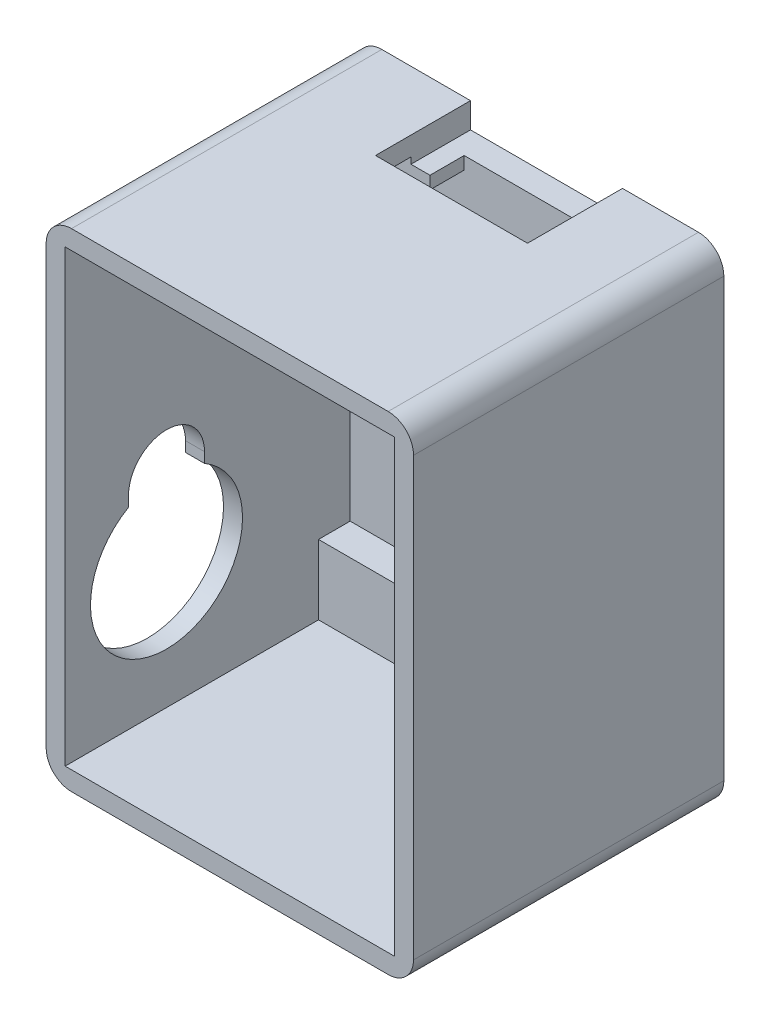
ISO-10303-21;
HEADER;
FILE_DESCRIPTION(('STEP AP214'),'2;1');
FILE_NAME('part.step','',(''),(''),'','','');
FILE_SCHEMA(('AUTOMOTIVE_DESIGN { 1 0 10303 214 1 1 1 1 }'));
ENDSEC;
DATA;
#1=APPLICATION_CONTEXT('core data for automotive mechanical design processes');
#2=APPLICATION_PROTOCOL_DEFINITION('international standard','automotive_design',2000,#1);
#3=PRODUCT_CONTEXT('',#1,'mechanical');
#4=PRODUCT('Part','Part','',(#3));
#5=PRODUCT_RELATED_PRODUCT_CATEGORY('part','',(#4));
#6=PRODUCT_DEFINITION_FORMATION('','',#4);
#7=PRODUCT_DEFINITION_CONTEXT('part definition',#1,'design');
#8=PRODUCT_DEFINITION('design','',#6,#7);
#9=PRODUCT_DEFINITION_SHAPE('','',#8);
#10=(LENGTH_UNIT() NAMED_UNIT(*) SI_UNIT(.MILLI.,.METRE.));
#11=(NAMED_UNIT(*) PLANE_ANGLE_UNIT() SI_UNIT($,.RADIAN.));
#12=(NAMED_UNIT(*) SI_UNIT($,.STERADIAN.) SOLID_ANGLE_UNIT());
#13=UNCERTAINTY_MEASURE_WITH_UNIT(LENGTH_MEASURE(1.E-05),#10,'distance_accuracy_value','');
#14=(GEOMETRIC_REPRESENTATION_CONTEXT(3) GLOBAL_UNCERTAINTY_ASSIGNED_CONTEXT((#13)) GLOBAL_UNIT_ASSIGNED_CONTEXT((#10,
#11,#12)) REPRESENTATION_CONTEXT('',''));
#15=CARTESIAN_POINT('',(0.,0.,0.));
#16=DIRECTION('',(0.,0.,1.));
#17=DIRECTION('',(1.,0.,0.));
#18=AXIS2_PLACEMENT_3D('',#15,#16,#17);
#19=CARTESIAN_POINT('',(0.,0.,1.5));
#20=DIRECTION('',(0.,0.,1.));
#21=DIRECTION('',(1.,0.,0.));
#22=AXIS2_PLACEMENT_3D('',#19,#20,#21);
#23=PLANE('',#22);
#24=DIRECTION('',(0.,-1.,0.));
#25=VECTOR('',#24,1.);
#26=CARTESIAN_POINT('',(19.5,-1.5,1.5));
#27=LINE('',#26,#25);
#28=CARTESIAN_POINT('',(19.5,-2.,1.5));
#29=VERTEX_POINT('',#28);
#30=CARTESIAN_POINT('',(19.5,-3.,1.5));
#31=VERTEX_POINT('',#30);
#32=EDGE_CURVE('E350',#29,#31,#27,.T.);
#33=ORIENTED_EDGE('',*,*,#32,.F.);
#34=DIRECTION('',(-1.,0.,0.));
#35=VECTOR('',#34,1.);
#36=CARTESIAN_POINT('',(0.,-2.,1.5));
#37=LINE('',#36,#35);
#38=CARTESIAN_POINT('',(10.5,-2.,1.5));
#39=VERTEX_POINT('',#38);
#40=EDGE_CURVE('E270',#29,#39,#37,.T.);
#41=ORIENTED_EDGE('',*,*,#40,.T.);
#42=DIRECTION('',(0.,1.,0.));
#43=VECTOR('',#42,1.);
#44=CARTESIAN_POINT('',(10.5,-1.5,1.5));
#45=LINE('',#44,#43);
#46=CARTESIAN_POINT('',(10.5,-3.,1.5));
#47=VERTEX_POINT('',#46);
#48=EDGE_CURVE('E333',#47,#39,#45,.T.);
#49=ORIENTED_EDGE('',*,*,#48,.F.);
#50=DIRECTION('',(-1.,0.,0.));
#51=VECTOR('',#50,1.);
#52=CARTESIAN_POINT('',(10.5,-3.,1.5));
#53=LINE('',#52,#51);
#54=CARTESIAN_POINT('',(1.5,-3.,1.5));
#55=VERTEX_POINT('',#54);
#56=EDGE_CURVE('E340',#47,#55,#53,.T.);
#57=ORIENTED_EDGE('',*,*,#56,.T.);
#58=DIRECTION('',(0.,-1.,0.));
#59=VECTOR('',#58,1.);
#60=CARTESIAN_POINT('',(1.5,0.,1.5));
#61=LINE('',#60,#59);
#62=CARTESIAN_POINT('',(1.5,-31.5,1.5));
#63=VERTEX_POINT('',#62);
#64=EDGE_CURVE('E382',#55,#63,#61,.T.);
#65=ORIENTED_EDGE('',*,*,#64,.T.);
#66=DIRECTION('',(-1.,0.,0.));
#67=VECTOR('',#66,1.);
#68=CARTESIAN_POINT('',(27.5,-31.5,1.5));
#69=LINE('',#68,#67);
#70=CARTESIAN_POINT('',(27.5,-31.5,1.5));
#71=VERTEX_POINT('',#70);
#72=EDGE_CURVE('E365',#71,#63,#69,.T.);
#73=ORIENTED_EDGE('',*,*,#72,.F.);
#74=DIRECTION('',(0.,1.,0.));
#75=VECTOR('',#74,1.);
#76=CARTESIAN_POINT('',(27.5,0.,1.5));
#77=LINE('',#76,#75);
#78=CARTESIAN_POINT('',(27.5,-3.,1.5));
#79=VERTEX_POINT('',#78);
#80=EDGE_CURVE('E384',#71,#79,#77,.T.);
#81=ORIENTED_EDGE('',*,*,#80,.T.);
#82=DIRECTION('',(1.,0.,0.));
#83=VECTOR('',#82,1.);
#84=CARTESIAN_POINT('',(19.5,-3.,1.5));
#85=LINE('',#84,#83);
#86=EDGE_CURVE('E361',#31,#79,#85,.T.);
#87=ORIENTED_EDGE('',*,*,#86,.F.);
#88=EDGE_LOOP('',(#33,#41,#49,#57,#65,#73,#81,#87));
#89=FACE_BOUND('',#88,.T.);
#90=ADVANCED_FACE('F35',(#89),#23,.T.);
#91=CARTESIAN_POINT('',(0.,-1.5,24.));
#92=DIRECTION('',(0.,-1.,0.));
#93=DIRECTION('',(0.,0.,-1.));
#94=AXIS2_PLACEMENT_3D('',#91,#92,#93);
#95=PLANE('',#94);
#96=DIRECTION('',(1.,0.,0.));
#97=VECTOR('',#96,1.);
#98=CARTESIAN_POINT('',(0.,-1.5,7.));
#99=LINE('',#98,#97);
#100=CARTESIAN_POINT('',(9.,-1.5,7.));
#101=VERTEX_POINT('',#100);
#102=CARTESIAN_POINT('',(21.,-1.5,7.));
#103=VERTEX_POINT('',#102);
#104=EDGE_CURVE('E239',#101,#103,#99,.T.);
#105=ORIENTED_EDGE('',*,*,#104,.T.);
#106=DIRECTION('',(0.,0.,-1.));
#107=VECTOR('',#106,1.);
#108=CARTESIAN_POINT('',(21.,-1.5,24.));
#109=LINE('',#108,#107);
#110=CARTESIAN_POINT('',(21.,-1.5,4.2));
#111=VERTEX_POINT('',#110);
#112=EDGE_CURVE('E279',#103,#111,#109,.T.);
#113=ORIENTED_EDGE('',*,*,#112,.T.);
#114=DIRECTION('',(1.,0.,0.));
#115=VECTOR('',#114,1.);
#116=CARTESIAN_POINT('',(19.5,-1.5,4.2));
#117=LINE('',#116,#115);
#118=CARTESIAN_POINT('',(27.5,-1.5,4.2));
#119=VERTEX_POINT('',#118);
#120=EDGE_CURVE('E363',#111,#119,#117,.T.);
#121=ORIENTED_EDGE('',*,*,#120,.T.);
#122=DIRECTION('',(0.,0.,-1.));
#123=VECTOR('',#122,1.);
#124=CARTESIAN_POINT('',(27.5,-1.5,24.));
#125=LINE('',#124,#123);
#126=CARTESIAN_POINT('',(27.5,-1.5,24.));
#127=VERTEX_POINT('',#126);
#128=EDGE_CURVE('E393',#127,#119,#125,.T.);
#129=ORIENTED_EDGE('',*,*,#128,.F.);
#130=DIRECTION('',(-1.,0.,0.));
#131=VECTOR('',#130,1.);
#132=CARTESIAN_POINT('',(0.,-1.5,24.));
#133=LINE('',#132,#131);
#134=CARTESIAN_POINT('',(1.5,-1.5,24.));
#135=VERTEX_POINT('',#134);
#136=EDGE_CURVE('E394',#127,#135,#133,.T.);
#137=ORIENTED_EDGE('',*,*,#136,.T.);
#138=DIRECTION('',(0.,0.,-1.));
#139=VECTOR('',#138,1.);
#140=CARTESIAN_POINT('',(1.5,-1.5,24.));
#141=LINE('',#140,#139);
#142=CARTESIAN_POINT('',(1.5,-1.5,4.2));
#143=VERTEX_POINT('',#142);
#144=EDGE_CURVE('E390',#135,#143,#141,.T.);
#145=ORIENTED_EDGE('',*,*,#144,.T.);
#146=DIRECTION('',(-1.,0.,0.));
#147=VECTOR('',#146,1.);
#148=CARTESIAN_POINT('',(10.5,-1.5,4.2));
#149=LINE('',#148,#147);
#150=CARTESIAN_POINT('',(9.,-1.5,4.2));
#151=VERTEX_POINT('',#150);
#152=EDGE_CURVE('E336',#151,#143,#149,.T.);
#153=ORIENTED_EDGE('',*,*,#152,.F.);
#154=DIRECTION('',(0.,0.,1.));
#155=VECTOR('',#154,1.);
#156=CARTESIAN_POINT('',(9.,-1.5,24.));
#157=LINE('',#156,#155);
#158=EDGE_CURVE('E265',#151,#101,#157,.T.);
#159=ORIENTED_EDGE('',*,*,#158,.T.);
#160=EDGE_LOOP('',(#105,#113,#121,#129,#137,#145,#153,#159));
#161=FACE_BOUND('',#160,.T.);
#162=ADVANCED_FACE('F501',(#161),#95,.T.);
#163=CARTESIAN_POINT('',(0.,0.,24.));
#164=DIRECTION('',(0.,-1.,0.));
#165=DIRECTION('',(0.,0.,-1.));
#166=AXIS2_PLACEMENT_3D('',#163,#164,#165);
#167=PLANE('',#166);
#168=DIRECTION('',(0.,0.,1.));
#169=VECTOR('',#168,1.);
#170=CARTESIAN_POINT('',(21.,0.,-1.5));
#171=LINE('',#170,#169);
#172=CARTESIAN_POINT('',(21.,0.,-0.5));
#173=VERTEX_POINT('',#172);
#174=CARTESIAN_POINT('',(21.,0.,7.));
#175=VERTEX_POINT('',#174);
#176=EDGE_CURVE('E251',#173,#175,#171,.T.);
#177=ORIENTED_EDGE('',*,*,#176,.T.);
#178=DIRECTION('',(1.,0.,0.));
#179=VECTOR('',#178,1.);
#180=CARTESIAN_POINT('',(21.,0.,7.));
#181=LINE('',#180,#179);
#182=CARTESIAN_POINT('',(9.,0.,7.));
#183=VERTEX_POINT('',#182);
#184=EDGE_CURVE('E236',#183,#175,#181,.T.);
#185=ORIENTED_EDGE('',*,*,#184,.F.);
#186=DIRECTION('',(0.,0.,1.));
#187=VECTOR('',#186,1.);
#188=CARTESIAN_POINT('',(9.,0.,-1.5));
#189=LINE('',#188,#187);
#190=CARTESIAN_POINT('',(9.,0.,-0.5));
#191=VERTEX_POINT('',#190);
#192=EDGE_CURVE('E244',#191,#183,#189,.T.);
#193=ORIENTED_EDGE('',*,*,#192,.F.);
#194=DIRECTION('',(1.,0.,0.));
#195=VECTOR('',#194,1.);
#196=CARTESIAN_POINT('',(0.,0.,-0.5));
#197=LINE('',#196,#195);
#198=CARTESIAN_POINT('',(2.,0.,-0.5));
#199=VERTEX_POINT('',#198);
#200=EDGE_CURVE('E287',#199,#191,#197,.T.);
#201=ORIENTED_EDGE('',*,*,#200,.F.);
#202=DIRECTION('',(0.,0.,-1.));
#203=VECTOR('',#202,1.);
#204=CARTESIAN_POINT('',(2.,0.,24.));
#205=LINE('',#204,#203);
#206=CARTESIAN_POINT('',(2.,0.,24.));
#207=VERTEX_POINT('',#206);
#208=EDGE_CURVE('E420',#199,#207,#205,.F.);
#209=ORIENTED_EDGE('',*,*,#208,.T.);
#210=DIRECTION('',(-1.,0.,0.));
#211=VECTOR('',#210,1.);
#212=CARTESIAN_POINT('',(0.,0.,24.));
#213=LINE('',#212,#211);
#214=CARTESIAN_POINT('',(27.,0.,24.));
#215=VERTEX_POINT('',#214);
#216=EDGE_CURVE('E417',#215,#207,#213,.T.);
#217=ORIENTED_EDGE('',*,*,#216,.F.);
#218=DIRECTION('',(0.,0.,-1.));
#219=VECTOR('',#218,1.);
#220=CARTESIAN_POINT('',(27.,0.,24.));
#221=LINE('',#220,#219);
#222=CARTESIAN_POINT('',(27.,0.,-0.5));
#223=VERTEX_POINT('',#222);
#224=EDGE_CURVE('E422',#215,#223,#221,.T.);
#225=ORIENTED_EDGE('',*,*,#224,.T.);
#226=EDGE_CURVE('E286',#173,#223,#197,.T.);
#227=ORIENTED_EDGE('',*,*,#226,.F.);
#228=EDGE_LOOP('',(#177,#185,#193,#201,#209,#217,#225,#227));
#229=FACE_BOUND('',#228,.T.);
#230=ADVANCED_FACE('F253',(#229),#167,.F.);
#231=CARTESIAN_POINT('',(19.5,-1.5,4.2));
#232=DIRECTION('',(0.,0.,-1.));
#233=DIRECTION('',(-1.,0.,0.));
#234=AXIS2_PLACEMENT_3D('',#231,#232,#233);
#235=PLANE('',#234);
#236=DIRECTION('',(0.,1.,0.));
#237=VECTOR('',#236,1.);
#238=CARTESIAN_POINT('',(21.,-1.5,4.2));
#239=LINE('',#238,#237);
#240=CARTESIAN_POINT('',(21.,-2.,4.2));
#241=VERTEX_POINT('',#240);
#242=EDGE_CURVE('E277',#241,#111,#239,.T.);
#243=ORIENTED_EDGE('',*,*,#242,.F.);
#244=DIRECTION('',(1.,0.,0.));
#245=VECTOR('',#244,1.);
#246=CARTESIAN_POINT('',(19.5,-2.,4.2));
#247=LINE('',#246,#245);
#248=CARTESIAN_POINT('',(19.5,-2.,4.2));
#249=VERTEX_POINT('',#248);
#250=EDGE_CURVE('E275',#249,#241,#247,.T.);
#251=ORIENTED_EDGE('',*,*,#250,.F.);
#252=DIRECTION('',(0.,1.,0.));
#253=VECTOR('',#252,1.);
#254=CARTESIAN_POINT('',(19.5,-1.5,4.2));
#255=LINE('',#254,#253);
#256=CARTESIAN_POINT('',(19.5,-3.,4.2));
#257=VERTEX_POINT('',#256);
#258=EDGE_CURVE('E347',#257,#249,#255,.T.);
#259=ORIENTED_EDGE('',*,*,#258,.F.);
#260=DIRECTION('',(1.,0.,0.));
#261=VECTOR('',#260,1.);
#262=CARTESIAN_POINT('',(19.5,-3.,4.2));
#263=LINE('',#262,#261);
#264=CARTESIAN_POINT('',(27.5,-3.,4.2));
#265=VERTEX_POINT('',#264);
#266=EDGE_CURVE('E355',#257,#265,#263,.T.);
#267=ORIENTED_EDGE('',*,*,#266,.T.);
#268=DIRECTION('',(0.,1.,0.));
#269=VECTOR('',#268,1.);
#270=CARTESIAN_POINT('',(27.5,-1.5,4.2));
#271=LINE('',#270,#269);
#272=EDGE_CURVE('E346',#265,#119,#271,.T.);
#273=ORIENTED_EDGE('',*,*,#272,.T.);
#274=ORIENTED_EDGE('',*,*,#120,.F.);
#275=EDGE_LOOP('',(#243,#251,#259,#267,#273,#274));
#276=FACE_BOUND('',#275,.T.);
#277=ADVANCED_FACE('F530',(#276),#235,.F.);
#278=CARTESIAN_POINT('',(19.5,0.,0.));
#279=DIRECTION('',(1.,0.,0.));
#280=DIRECTION('',(0.,0.,-1.));
#281=AXIS2_PLACEMENT_3D('',#278,#279,#280);
#282=PLANE('',#281);
#283=DIRECTION('',(0.,0.,1.));
#284=VECTOR('',#283,1.);
#285=CARTESIAN_POINT('',(19.5,-2.,0.));
#286=LINE('',#285,#284);
#287=EDGE_CURVE('E273',#29,#249,#286,.T.);
#288=ORIENTED_EDGE('',*,*,#287,.F.);
#289=ORIENTED_EDGE('',*,*,#32,.T.);
#290=DIRECTION('',(0.,0.,1.));
#291=VECTOR('',#290,1.);
#292=CARTESIAN_POINT('',(19.5,-3.,4.2));
#293=LINE('',#292,#291);
#294=EDGE_CURVE('E353',#31,#257,#293,.T.);
#295=ORIENTED_EDGE('',*,*,#294,.T.);
#296=ORIENTED_EDGE('',*,*,#258,.T.);
#297=EDGE_LOOP('',(#288,#289,#295,#296));
#298=FACE_BOUND('',#297,.T.);
#299=ADVANCED_FACE('F525',(#298),#282,.F.);
#300=CARTESIAN_POINT('',(10.5,-1.5,4.2));
#301=DIRECTION('',(0.,0.,-1.));
#302=DIRECTION('',(-1.,0.,0.));
#303=AXIS2_PLACEMENT_3D('',#300,#301,#302);
#304=PLANE('',#303);
#305=DIRECTION('',(1.,0.,0.));
#306=VECTOR('',#305,1.);
#307=CARTESIAN_POINT('',(10.5,-2.,4.2));
#308=LINE('',#307,#306);
#309=CARTESIAN_POINT('',(9.,-2.,4.2));
#310=VERTEX_POINT('',#309);
#311=CARTESIAN_POINT('',(10.5,-2.,4.2));
#312=VERTEX_POINT('',#311);
#313=EDGE_CURVE('E50',#310,#312,#308,.T.);
#314=ORIENTED_EDGE('',*,*,#313,.F.);
#315=DIRECTION('',(0.,-1.,0.));
#316=VECTOR('',#315,1.);
#317=CARTESIAN_POINT('',(9.,-1.5,4.2));
#318=LINE('',#317,#316);
#319=EDGE_CURVE('E263',#151,#310,#318,.T.);
#320=ORIENTED_EDGE('',*,*,#319,.F.);
#321=ORIENTED_EDGE('',*,*,#152,.T.);
#322=DIRECTION('',(0.,-1.,0.));
#323=VECTOR('',#322,1.);
#324=CARTESIAN_POINT('',(1.5,-1.5,4.2));
#325=LINE('',#324,#323);
#326=CARTESIAN_POINT('',(1.5,-3.,4.2));
#327=VERTEX_POINT('',#326);
#328=EDGE_CURVE('E321',#143,#327,#325,.T.);
#329=ORIENTED_EDGE('',*,*,#328,.T.);
#330=DIRECTION('',(-1.,0.,0.));
#331=VECTOR('',#330,1.);
#332=CARTESIAN_POINT('',(10.5,-3.,4.2));
#333=LINE('',#332,#331);
#334=CARTESIAN_POINT('',(10.5,-3.,4.2));
#335=VERTEX_POINT('',#334);
#336=EDGE_CURVE('E343',#335,#327,#333,.T.);
#337=ORIENTED_EDGE('',*,*,#336,.F.);
#338=DIRECTION('',(0.,-1.,0.));
#339=VECTOR('',#338,1.);
#340=CARTESIAN_POINT('',(10.5,-1.5,4.2));
#341=LINE('',#340,#339);
#342=EDGE_CURVE('E328',#312,#335,#341,.T.);
#343=ORIENTED_EDGE('',*,*,#342,.F.);
#344=EDGE_LOOP('',(#314,#320,#321,#329,#337,#343));
#345=FACE_BOUND('',#344,.T.);
#346=ADVANCED_FACE('F506',(#345),#304,.F.);
#347=CARTESIAN_POINT('',(10.5,0.,0.));
#348=DIRECTION('',(1.,0.,0.));
#349=DIRECTION('',(0.,1.,0.));
#350=AXIS2_PLACEMENT_3D('',#347,#348,#349);
#351=PLANE('',#350);
#352=ORIENTED_EDGE('',*,*,#48,.T.);
#353=DIRECTION('',(0.,0.,1.));
#354=VECTOR('',#353,1.);
#355=CARTESIAN_POINT('',(10.5,-2.,0.));
#356=LINE('',#355,#354);
#357=EDGE_CURVE('E267',#39,#312,#356,.T.);
#358=ORIENTED_EDGE('',*,*,#357,.T.);
#359=ORIENTED_EDGE('',*,*,#342,.T.);
#360=DIRECTION('',(0.,0.,-1.));
#361=VECTOR('',#360,1.);
#362=CARTESIAN_POINT('',(10.5,-3.,4.2));
#363=LINE('',#362,#361);
#364=EDGE_CURVE('E330',#335,#47,#363,.T.);
#365=ORIENTED_EDGE('',*,*,#364,.T.);
#366=EDGE_LOOP('',(#352,#358,#359,#365));
#367=FACE_BOUND('',#366,.T.);
#368=ADVANCED_FACE('F512',(#367),#351,.T.);
#369=CARTESIAN_POINT('',(0.,0.,-0.5));
#370=DIRECTION('',(0.,0.,1.));
#371=DIRECTION('',(1.,0.,0.));
#372=AXIS2_PLACEMENT_3D('',#369,#370,#371);
#373=PLANE('',#372);
#374=DIRECTION('',(0.,-1.,0.));
#375=VECTOR('',#374,1.);
#376=CARTESIAN_POINT('',(21.,0.,-0.5));
#377=LINE('',#376,#375);
#378=CARTESIAN_POINT('',(21.,-2.,-0.5));
#379=VERTEX_POINT('',#378);
#380=EDGE_CURVE('E11',#173,#379,#377,.T.);
#381=ORIENTED_EDGE('',*,*,#380,.F.);
#382=ORIENTED_EDGE('',*,*,#226,.T.);
#383=CARTESIAN_POINT('',(27.,-2.,-0.5));
#384=DIRECTION('',(0.,0.,1.));
#385=DIRECTION('',(1.,0.,0.));
#386=AXIS2_PLACEMENT_3D('',#383,#384,#385);
#387=CIRCLE('',#386,2.);
#388=CARTESIAN_POINT('',(29.,-2.,-0.5));
#389=VERTEX_POINT('',#388);
#390=EDGE_CURVE('E431',#223,#389,#387,.F.);
#391=ORIENTED_EDGE('',*,*,#390,.T.);
#392=DIRECTION('',(0.,-1.,0.));
#393=VECTOR('',#392,1.);
#394=CARTESIAN_POINT('',(29.,0.,-0.5));
#395=LINE('',#394,#393);
#396=CARTESIAN_POINT('',(29.,-36.5,-0.5));
#397=VERTEX_POINT('',#396);
#398=EDGE_CURVE('E289',#389,#397,#395,.T.);
#399=ORIENTED_EDGE('',*,*,#398,.T.);
#400=CARTESIAN_POINT('',(27.,-36.5,-0.5));
#401=DIRECTION('',(0.,0.,1.));
#402=DIRECTION('',(1.,0.,0.));
#403=AXIS2_PLACEMENT_3D('',#400,#401,#402);
#404=CIRCLE('',#403,2.);
#405=CARTESIAN_POINT('',(27.,-38.5,-0.5));
#406=VERTEX_POINT('',#405);
#407=EDGE_CURVE('E429',#397,#406,#404,.F.);
#408=ORIENTED_EDGE('',*,*,#407,.T.);
#409=DIRECTION('',(-1.,0.,0.));
#410=VECTOR('',#409,1.);
#411=CARTESIAN_POINT('',(0.,-38.5,-0.5));
#412=LINE('',#411,#410);
#413=CARTESIAN_POINT('',(2.,-38.5,-0.5));
#414=VERTEX_POINT('',#413);
#415=EDGE_CURVE('E292',#406,#414,#412,.T.);
#416=ORIENTED_EDGE('',*,*,#415,.T.);
#417=CARTESIAN_POINT('',(2.,-36.5,-0.5));
#418=DIRECTION('',(0.,0.,1.));
#419=DIRECTION('',(1.,0.,0.));
#420=AXIS2_PLACEMENT_3D('',#417,#418,#419);
#421=CIRCLE('',#420,2.);
#422=CARTESIAN_POINT('',(0.,-36.5,-0.5));
#423=VERTEX_POINT('',#422);
#424=EDGE_CURVE('E427',#414,#423,#421,.F.);
#425=ORIENTED_EDGE('',*,*,#424,.T.);
#426=DIRECTION('',(0.,1.,0.));
#427=VECTOR('',#426,1.);
#428=CARTESIAN_POINT('',(0.,0.,-0.5));
#429=LINE('',#428,#427);
#430=CARTESIAN_POINT('',(0.,-2.,-0.5));
#431=VERTEX_POINT('',#430);
#432=EDGE_CURVE('E283',#423,#431,#429,.T.);
#433=ORIENTED_EDGE('',*,*,#432,.T.);
#434=CARTESIAN_POINT('',(2.,-2.,-0.5));
#435=DIRECTION('',(0.,0.,1.));
#436=DIRECTION('',(1.,0.,0.));
#437=AXIS2_PLACEMENT_3D('',#434,#435,#436);
#438=CIRCLE('',#437,2.);
#439=EDGE_CURVE('E425',#431,#199,#438,.F.);
#440=ORIENTED_EDGE('',*,*,#439,.T.);
#441=ORIENTED_EDGE('',*,*,#200,.T.);
#442=DIRECTION('',(0.,1.,0.));
#443=VECTOR('',#442,1.);
#444=CARTESIAN_POINT('',(9.,0.,-0.5));
#445=LINE('',#444,#443);
#446=CARTESIAN_POINT('',(9.,-2.,-0.5));
#447=VERTEX_POINT('',#446);
#448=EDGE_CURVE('E247',#447,#191,#445,.T.);
#449=ORIENTED_EDGE('',*,*,#448,.F.);
#450=DIRECTION('',(-1.,0.,0.));
#451=VECTOR('',#450,1.);
#452=CARTESIAN_POINT('',(0.,-2.,-0.5));
#453=LINE('',#452,#451);
#454=EDGE_CURVE('E43',#379,#447,#453,.T.);
#455=ORIENTED_EDGE('',*,*,#454,.F.);
#456=EDGE_LOOP('',(#381,#382,#391,#399,#408,#416,#425,#433,#440,#441,#449,#455));
#457=FACE_BOUND('',#456,.T.);
#458=ADVANCED_FACE('F461',(#457),#373,.F.);
#459=CARTESIAN_POINT('',(1.5,0.,24.));
#460=DIRECTION('',(1.,0.,0.));
#461=DIRECTION('',(0.,1.,0.));
#462=AXIS2_PLACEMENT_3D('',#459,#460,#461);
#463=PLANE('',#462);
#464=CARTESIAN_POINT('',(1.5,-21.,16.));
#465=DIRECTION('',(-1.,0.,0.));
#466=DIRECTION('',(0.,-1.,0.));
#467=AXIS2_PLACEMENT_3D('',#464,#465,#466);
#468=CIRCLE('',#467,3.);
#469=CARTESIAN_POINT('',(1.5,-21.,19.));
#470=VERTEX_POINT('',#469);
#471=CARTESIAN_POINT('',(1.5,-21.,13.));
#472=VERTEX_POINT('',#471);
#473=EDGE_CURVE('E296',#470,#472,#468,.T.);
#474=ORIENTED_EDGE('',*,*,#473,.T.);
#475=DIRECTION('',(0.,-1.,0.));
#476=VECTOR('',#475,1.);
#477=CARTESIAN_POINT('',(1.5,-21.,13.));
#478=LINE('',#477,#476);
#479=CARTESIAN_POINT('',(1.5,-21.8038475772934,13.));
#480=VERTEX_POINT('',#479);
#481=EDGE_CURVE('E299',#472,#480,#478,.T.);
#482=ORIENTED_EDGE('',*,*,#481,.T.);
#483=CARTESIAN_POINT('',(1.5,-27.,16.));
#484=DIRECTION('',(-1.,0.,0.));
#485=DIRECTION('',(0.,-1.,0.));
#486=AXIS2_PLACEMENT_3D('',#483,#484,#485);
#487=CIRCLE('',#486,6.);
#488=CARTESIAN_POINT('',(1.5,-21.8038475772934,19.));
#489=VERTEX_POINT('',#488);
#490=EDGE_CURVE('E303',#480,#489,#487,.T.);
#491=ORIENTED_EDGE('',*,*,#490,.T.);
#492=DIRECTION('',(0.,1.,0.));
#493=VECTOR('',#492,1.);
#494=CARTESIAN_POINT('',(1.5,-21.,19.));
#495=LINE('',#494,#493);
#496=EDGE_CURVE('E306',#489,#470,#495,.T.);
#497=ORIENTED_EDGE('',*,*,#496,.T.);
#498=EDGE_LOOP('',(#474,#482,#491,#497));
#499=FACE_BOUND('',#498,.T.);
#500=DIRECTION('',(0.,0.,-1.));
#501=VECTOR('',#500,1.);
#502=CARTESIAN_POINT('',(1.5,-3.,4.2));
#503=LINE('',#502,#501);
#504=EDGE_CURVE('E331',#327,#55,#503,.T.);
#505=ORIENTED_EDGE('',*,*,#504,.F.);
#506=ORIENTED_EDGE('',*,*,#328,.F.);
#507=ORIENTED_EDGE('',*,*,#144,.F.);
#508=DIRECTION('',(0.,-1.,0.));
#509=VECTOR('',#508,1.);
#510=CARTESIAN_POINT('',(1.5,0.,24.));
#511=LINE('',#510,#509);
#512=CARTESIAN_POINT('',(1.5,-37.,24.));
#513=VERTEX_POINT('',#512);
#514=EDGE_CURVE('E399',#135,#513,#511,.T.);
#515=ORIENTED_EDGE('',*,*,#514,.T.);
#516=DIRECTION('',(0.,0.,-1.));
#517=VECTOR('',#516,1.);
#518=CARTESIAN_POINT('',(1.5,-37.,24.));
#519=LINE('',#518,#517);
#520=CARTESIAN_POINT('',(1.5,-37.,4.));
#521=VERTEX_POINT('',#520);
#522=EDGE_CURVE('E385',#513,#521,#519,.T.);
#523=ORIENTED_EDGE('',*,*,#522,.T.);
#524=DIRECTION('',(0.,-1.,0.));
#525=VECTOR('',#524,1.);
#526=CARTESIAN_POINT('',(1.5,-31.5,4.));
#527=LINE('',#526,#525);
#528=CARTESIAN_POINT('',(1.5,-31.5,4.));
#529=VERTEX_POINT('',#528);
#530=EDGE_CURVE('E371',#529,#521,#527,.T.);
#531=ORIENTED_EDGE('',*,*,#530,.F.);
#532=DIRECTION('',(0.,0.,-1.));
#533=VECTOR('',#532,1.);
#534=CARTESIAN_POINT('',(1.5,-31.5,4.));
#535=LINE('',#534,#533);
#536=EDGE_CURVE('E375',#529,#63,#535,.T.);
#537=ORIENTED_EDGE('',*,*,#536,.T.);
#538=ORIENTED_EDGE('',*,*,#64,.F.);
#539=EDGE_LOOP('',(#505,#506,#507,#515,#523,#531,#537,#538));
#540=FACE_BOUND('',#539,.T.);
#541=ADVANCED_FACE('F544',(#499,#540),#463,.T.);
#542=CARTESIAN_POINT('',(27.5,0.,24.));
#543=DIRECTION('',(-1.,0.,0.));
#544=DIRECTION('',(0.,-1.,0.));
#545=AXIS2_PLACEMENT_3D('',#542,#543,#544);
#546=PLANE('',#545);
#547=ORIENTED_EDGE('',*,*,#128,.T.);
#548=ORIENTED_EDGE('',*,*,#272,.F.);
#549=DIRECTION('',(0.,0.,1.));
#550=VECTOR('',#549,1.);
#551=CARTESIAN_POINT('',(27.5,-3.,4.2));
#552=LINE('',#551,#550);
#553=EDGE_CURVE('E351',#79,#265,#552,.T.);
#554=ORIENTED_EDGE('',*,*,#553,.F.);
#555=ORIENTED_EDGE('',*,*,#80,.F.);
#556=DIRECTION('',(0.,0.,-1.));
#557=VECTOR('',#556,1.);
#558=CARTESIAN_POINT('',(27.5,-31.5,4.));
#559=LINE('',#558,#557);
#560=CARTESIAN_POINT('',(27.5,-31.5,4.));
#561=VERTEX_POINT('',#560);
#562=EDGE_CURVE('E380',#561,#71,#559,.T.);
#563=ORIENTED_EDGE('',*,*,#562,.F.);
#564=DIRECTION('',(0.,1.,0.));
#565=VECTOR('',#564,1.);
#566=CARTESIAN_POINT('',(27.5,-31.5,4.));
#567=LINE('',#566,#565);
#568=CARTESIAN_POINT('',(27.5,-37.,4.));
#569=VERTEX_POINT('',#568);
#570=EDGE_CURVE('E366',#569,#561,#567,.T.);
#571=ORIENTED_EDGE('',*,*,#570,.F.);
#572=DIRECTION('',(0.,0.,-1.));
#573=VECTOR('',#572,1.);
#574=CARTESIAN_POINT('',(27.5,-37.,24.));
#575=LINE('',#574,#573);
#576=CARTESIAN_POINT('',(27.5,-37.,24.));
#577=VERTEX_POINT('',#576);
#578=EDGE_CURVE('E389',#577,#569,#575,.T.);
#579=ORIENTED_EDGE('',*,*,#578,.F.);
#580=DIRECTION('',(0.,1.,0.));
#581=VECTOR('',#580,1.);
#582=CARTESIAN_POINT('',(27.5,0.,24.));
#583=LINE('',#582,#581);
#584=EDGE_CURVE('E405',#577,#127,#583,.T.);
#585=ORIENTED_EDGE('',*,*,#584,.T.);
#586=EDGE_LOOP('',(#547,#548,#554,#555,#563,#571,#579,#585));
#587=FACE_BOUND('',#586,.T.);
#588=ADVANCED_FACE('F537',(#587),#546,.T.);
#589=CARTESIAN_POINT('',(0.,-37.,24.));
#590=DIRECTION('',(0.,1.,0.));
#591=DIRECTION('',(0.,0.,1.));
#592=AXIS2_PLACEMENT_3D('',#589,#590,#591);
#593=PLANE('',#592);
#594=ORIENTED_EDGE('',*,*,#578,.T.);
#595=DIRECTION('',(1.,0.,0.));
#596=VECTOR('',#595,1.);
#597=CARTESIAN_POINT('',(27.5,-37.,4.));
#598=LINE('',#597,#596);
#599=EDGE_CURVE('E373',#521,#569,#598,.T.);
#600=ORIENTED_EDGE('',*,*,#599,.F.);
#601=ORIENTED_EDGE('',*,*,#522,.F.);
#602=DIRECTION('',(1.,0.,0.));
#603=VECTOR('',#602,1.);
#604=CARTESIAN_POINT('',(0.,-37.,24.));
#605=LINE('',#604,#603);
#606=EDGE_CURVE('E403',#513,#577,#605,.T.);
#607=ORIENTED_EDGE('',*,*,#606,.T.);
#608=EDGE_LOOP('',(#594,#600,#601,#607));
#609=FACE_BOUND('',#608,.T.);
#610=ADVANCED_FACE('F548',(#609),#593,.T.);
#611=CARTESIAN_POINT('',(0.,0.,24.));
#612=DIRECTION('',(1.,0.,0.));
#613=DIRECTION('',(0.,1.,0.));
#614=AXIS2_PLACEMENT_3D('',#611,#612,#613);
#615=PLANE('',#614);
#616=DIRECTION('',(0.,-1.,0.));
#617=VECTOR('',#616,1.);
#618=CARTESIAN_POINT('',(0.,-21.,13.));
#619=LINE('',#618,#617);
#620=CARTESIAN_POINT('',(0.,-21.,13.));
#621=VERTEX_POINT('',#620);
#622=CARTESIAN_POINT('',(0.,-21.8038475772934,13.));
#623=VERTEX_POINT('',#622);
#624=EDGE_CURVE('E311',#621,#623,#619,.T.);
#625=ORIENTED_EDGE('',*,*,#624,.F.);
#626=CARTESIAN_POINT('',(0.,-21.,16.));
#627=DIRECTION('',(-1.,0.,0.));
#628=DIRECTION('',(0.,-1.,0.));
#629=AXIS2_PLACEMENT_3D('',#626,#627,#628);
#630=CIRCLE('',#629,3.);
#631=CARTESIAN_POINT('',(0.,-21.,19.));
#632=VERTEX_POINT('',#631);
#633=EDGE_CURVE('E295',#632,#621,#630,.T.);
#634=ORIENTED_EDGE('',*,*,#633,.F.);
#635=DIRECTION('',(0.,1.,0.));
#636=VECTOR('',#635,1.);
#637=CARTESIAN_POINT('',(0.,-21.,19.));
#638=LINE('',#637,#636);
#639=CARTESIAN_POINT('',(0.,-21.8038475772934,19.));
#640=VERTEX_POINT('',#639);
#641=EDGE_CURVE('E300',#640,#632,#638,.T.);
#642=ORIENTED_EDGE('',*,*,#641,.F.);
#643=CARTESIAN_POINT('',(0.,-27.,16.));
#644=DIRECTION('',(-1.,0.,0.));
#645=DIRECTION('',(0.,-1.,0.));
#646=AXIS2_PLACEMENT_3D('',#643,#644,#645);
#647=CIRCLE('',#646,6.);
#648=EDGE_CURVE('E314',#623,#640,#647,.T.);
#649=ORIENTED_EDGE('',*,*,#648,.F.);
#650=EDGE_LOOP('',(#625,#634,#642,#649));
#651=FACE_BOUND('',#650,.T.);
#652=ORIENTED_EDGE('',*,*,#432,.F.);
#653=DIRECTION('',(0.,0.,-1.));
#654=VECTOR('',#653,1.);
#655=CARTESIAN_POINT('',(0.,-36.5,24.));
#656=LINE('',#655,#654);
#657=CARTESIAN_POINT('',(0.,-36.5,24.));
#658=VERTEX_POINT('',#657);
#659=EDGE_CURVE('E454',#423,#658,#656,.F.);
#660=ORIENTED_EDGE('',*,*,#659,.T.);
#661=DIRECTION('',(0.,-1.,0.));
#662=VECTOR('',#661,1.);
#663=CARTESIAN_POINT('',(0.,0.,24.));
#664=LINE('',#663,#662);
#665=CARTESIAN_POINT('',(0.,-2.,24.));
#666=VERTEX_POINT('',#665);
#667=EDGE_CURVE('E388',#666,#658,#664,.T.);
#668=ORIENTED_EDGE('',*,*,#667,.F.);
#669=DIRECTION('',(0.,0.,-1.));
#670=VECTOR('',#669,1.);
#671=CARTESIAN_POINT('',(0.,-2.,24.));
#672=LINE('',#671,#670);
#673=EDGE_CURVE('E451',#666,#431,#672,.T.);
#674=ORIENTED_EDGE('',*,*,#673,.T.);
#675=EDGE_LOOP('',(#652,#660,#668,#674));
#676=FACE_BOUND('',#675,.T.);
#677=ADVANCED_FACE('F473',(#651,#676),#615,.F.);
#678=CARTESIAN_POINT('',(0.,-38.5,24.));
#679=DIRECTION('',(0.,1.,0.));
#680=DIRECTION('',(0.,0.,1.));
#681=AXIS2_PLACEMENT_3D('',#678,#679,#680);
#682=PLANE('',#681);
#683=ORIENTED_EDGE('',*,*,#415,.F.);
#684=DIRECTION('',(0.,0.,-1.));
#685=VECTOR('',#684,1.);
#686=CARTESIAN_POINT('',(27.,-38.5,24.));
#687=LINE('',#686,#685);
#688=CARTESIAN_POINT('',(27.,-38.5,24.));
#689=VERTEX_POINT('',#688);
#690=EDGE_CURVE('E449',#406,#689,#687,.F.);
#691=ORIENTED_EDGE('',*,*,#690,.T.);
#692=DIRECTION('',(1.,0.,0.));
#693=VECTOR('',#692,1.);
#694=CARTESIAN_POINT('',(0.,-38.5,24.));
#695=LINE('',#694,#693);
#696=CARTESIAN_POINT('',(2.,-38.5,24.));
#697=VERTEX_POINT('',#696);
#698=EDGE_CURVE('E411',#697,#689,#695,.T.);
#699=ORIENTED_EDGE('',*,*,#698,.F.);
#700=DIRECTION('',(0.,0.,-1.));
#701=VECTOR('',#700,1.);
#702=CARTESIAN_POINT('',(2.,-38.5,24.));
#703=LINE('',#702,#701);
#704=EDGE_CURVE('E446',#697,#414,#703,.T.);
#705=ORIENTED_EDGE('',*,*,#704,.T.);
#706=EDGE_LOOP('',(#683,#691,#699,#705));
#707=FACE_BOUND('',#706,.T.);
#708=ADVANCED_FACE('F482',(#707),#682,.F.);
#709=CARTESIAN_POINT('',(29.,0.,24.));
#710=DIRECTION('',(-1.,0.,0.));
#711=DIRECTION('',(0.,-1.,0.));
#712=AXIS2_PLACEMENT_3D('',#709,#710,#711);
#713=PLANE('',#712);
#714=ORIENTED_EDGE('',*,*,#398,.F.);
#715=DIRECTION('',(0.,0.,-1.));
#716=VECTOR('',#715,1.);
#717=CARTESIAN_POINT('',(29.,-2.,24.));
#718=LINE('',#717,#716);
#719=CARTESIAN_POINT('',(29.,-2.,24.));
#720=VERTEX_POINT('',#719);
#721=EDGE_CURVE('E436',#389,#720,#718,.F.);
#722=ORIENTED_EDGE('',*,*,#721,.T.);
#723=DIRECTION('',(0.,1.,0.));
#724=VECTOR('',#723,1.);
#725=CARTESIAN_POINT('',(29.,0.,24.));
#726=LINE('',#725,#724);
#727=CARTESIAN_POINT('',(29.,-36.5,24.));
#728=VERTEX_POINT('',#727);
#729=EDGE_CURVE('E414',#728,#720,#726,.T.);
#730=ORIENTED_EDGE('',*,*,#729,.F.);
#731=DIRECTION('',(0.,0.,-1.));
#732=VECTOR('',#731,1.);
#733=CARTESIAN_POINT('',(29.,-36.5,24.));
#734=LINE('',#733,#732);
#735=EDGE_CURVE('E433',#728,#397,#734,.T.);
#736=ORIENTED_EDGE('',*,*,#735,.T.);
#737=EDGE_LOOP('',(#714,#722,#730,#736));
#738=FACE_BOUND('',#737,.T.);
#739=ADVANCED_FACE('F491',(#738),#713,.F.);
#740=CARTESIAN_POINT('',(0.,0.,24.));
#741=DIRECTION('',(0.,0.,1.));
#742=DIRECTION('',(1.,0.,0.));
#743=AXIS2_PLACEMENT_3D('',#740,#741,#742);
#744=PLANE('',#743);
#745=ORIENTED_EDGE('',*,*,#514,.F.);
#746=ORIENTED_EDGE('',*,*,#136,.F.);
#747=ORIENTED_EDGE('',*,*,#584,.F.);
#748=ORIENTED_EDGE('',*,*,#606,.F.);
#749=EDGE_LOOP('',(#745,#746,#747,#748));
#750=FACE_BOUND('',#749,.T.);
#751=ORIENTED_EDGE('',*,*,#729,.T.);
#752=CARTESIAN_POINT('',(27.,-2.,24.));
#753=DIRECTION('',(0.,0.,1.));
#754=DIRECTION('',(1.,0.,0.));
#755=AXIS2_PLACEMENT_3D('',#752,#753,#754);
#756=CIRCLE('',#755,2.);
#757=EDGE_CURVE('E444',#720,#215,#756,.T.);
#758=ORIENTED_EDGE('',*,*,#757,.T.);
#759=ORIENTED_EDGE('',*,*,#216,.T.);
#760=CARTESIAN_POINT('',(2.,-2.,24.));
#761=DIRECTION('',(0.,0.,1.));
#762=DIRECTION('',(1.,0.,0.));
#763=AXIS2_PLACEMENT_3D('',#760,#761,#762);
#764=CIRCLE('',#763,2.);
#765=EDGE_CURVE('E438',#207,#666,#764,.T.);
#766=ORIENTED_EDGE('',*,*,#765,.T.);
#767=ORIENTED_EDGE('',*,*,#667,.T.);
#768=CARTESIAN_POINT('',(2.,-36.5,24.));
#769=DIRECTION('',(0.,0.,1.));
#770=DIRECTION('',(1.,0.,0.));
#771=AXIS2_PLACEMENT_3D('',#768,#769,#770);
#772=CIRCLE('',#771,2.);
#773=EDGE_CURVE('E440',#658,#697,#772,.T.);
#774=ORIENTED_EDGE('',*,*,#773,.T.);
#775=ORIENTED_EDGE('',*,*,#698,.T.);
#776=CARTESIAN_POINT('',(27.,-36.5,24.));
#777=DIRECTION('',(0.,0.,1.));
#778=DIRECTION('',(1.,0.,0.));
#779=AXIS2_PLACEMENT_3D('',#776,#777,#778);
#780=CIRCLE('',#779,2.);
#781=EDGE_CURVE('E442',#689,#728,#780,.T.);
#782=ORIENTED_EDGE('',*,*,#781,.T.);
#783=EDGE_LOOP('',(#751,#758,#759,#766,#767,#774,#775,#782));
#784=FACE_BOUND('',#783,.T.);
#785=ADVANCED_FACE('F469',(#750,#784),#744,.T.);
#786=CARTESIAN_POINT('',(27.5,-31.5,4.));
#787=DIRECTION('',(0.,-1.,0.));
#788=DIRECTION('',(0.,0.,-1.));
#789=AXIS2_PLACEMENT_3D('',#786,#787,#788);
#790=PLANE('',#789);
#791=ORIENTED_EDGE('',*,*,#72,.T.);
#792=ORIENTED_EDGE('',*,*,#536,.F.);
#793=DIRECTION('',(-1.,0.,0.));
#794=VECTOR('',#793,1.);
#795=CARTESIAN_POINT('',(27.5,-31.5,4.));
#796=LINE('',#795,#794);
#797=EDGE_CURVE('E369',#561,#529,#796,.T.);
#798=ORIENTED_EDGE('',*,*,#797,.F.);
#799=ORIENTED_EDGE('',*,*,#562,.T.);
#800=EDGE_LOOP('',(#791,#792,#798,#799));
#801=FACE_BOUND('',#800,.T.);
#802=ADVANCED_FACE('F556',(#801),#790,.F.);
#803=CARTESIAN_POINT('',(0.,0.,4.));
#804=DIRECTION('',(0.,0.,-1.));
#805=DIRECTION('',(-1.,0.,0.));
#806=AXIS2_PLACEMENT_3D('',#803,#804,#805);
#807=PLANE('',#806);
#808=ORIENTED_EDGE('',*,*,#570,.T.);
#809=ORIENTED_EDGE('',*,*,#797,.T.);
#810=ORIENTED_EDGE('',*,*,#530,.T.);
#811=ORIENTED_EDGE('',*,*,#599,.T.);
#812=EDGE_LOOP('',(#808,#809,#810,#811));
#813=FACE_BOUND('',#812,.T.);
#814=ADVANCED_FACE('F550',(#813),#807,.F.);
#815=CARTESIAN_POINT('',(19.5,-3.,4.2));
#816=DIRECTION('',(0.,1.,0.));
#817=DIRECTION('',(-1.,0.,0.));
#818=AXIS2_PLACEMENT_3D('',#815,#816,#817);
#819=PLANE('',#818);
#820=ORIENTED_EDGE('',*,*,#553,.T.);
#821=ORIENTED_EDGE('',*,*,#266,.F.);
#822=ORIENTED_EDGE('',*,*,#294,.F.);
#823=ORIENTED_EDGE('',*,*,#86,.T.);
#824=EDGE_LOOP('',(#820,#821,#822,#823));
#825=FACE_BOUND('',#824,.T.);
#826=ADVANCED_FACE('F559',(#825),#819,.F.);
#827=CARTESIAN_POINT('',(10.5,-3.,4.2));
#828=DIRECTION('',(0.,1.,0.));
#829=DIRECTION('',(-1.,0.,0.));
#830=AXIS2_PLACEMENT_3D('',#827,#828,#829);
#831=PLANE('',#830);
#832=ORIENTED_EDGE('',*,*,#504,.T.);
#833=ORIENTED_EDGE('',*,*,#56,.F.);
#834=ORIENTED_EDGE('',*,*,#364,.F.);
#835=ORIENTED_EDGE('',*,*,#336,.T.);
#836=EDGE_LOOP('',(#832,#833,#834,#835));
#837=FACE_BOUND('',#836,.T.);
#838=ADVANCED_FACE('F515',(#837),#831,.F.);
#839=CARTESIAN_POINT('',(1.5,-21.,16.));
#840=DIRECTION('',(-1.,0.,0.));
#841=DIRECTION('',(0.,-1.,0.));
#842=AXIS2_PLACEMENT_3D('',#839,#840,#841);
#843=CYLINDRICAL_SURFACE('',#842,3.);
#844=ORIENTED_EDGE('',*,*,#633,.T.);
#845=DIRECTION('',(-1.,0.,0.));
#846=VECTOR('',#845,1.);
#847=CARTESIAN_POINT('',(1.5,-21.,13.));
#848=LINE('',#847,#846);
#849=EDGE_CURVE('E309',#472,#621,#848,.T.);
#850=ORIENTED_EDGE('',*,*,#849,.F.);
#851=ORIENTED_EDGE('',*,*,#473,.F.);
#852=DIRECTION('',(-1.,0.,0.));
#853=VECTOR('',#852,1.);
#854=CARTESIAN_POINT('',(1.5,-21.,19.));
#855=LINE('',#854,#853);
#856=EDGE_CURVE('E319',#470,#632,#855,.T.);
#857=ORIENTED_EDGE('',*,*,#856,.T.);
#858=EDGE_LOOP('',(#844,#850,#851,#857));
#859=FACE_BOUND('',#858,.T.);
#860=ADVANCED_FACE('F566',(#859),#843,.F.);
#861=CARTESIAN_POINT('',(1.5,-21.,19.));
#862=DIRECTION('',(0.,0.,1.));
#863=DIRECTION('',(1.,0.,0.));
#864=AXIS2_PLACEMENT_3D('',#861,#862,#863);
#865=PLANE('',#864);
#866=ORIENTED_EDGE('',*,*,#641,.T.);
#867=ORIENTED_EDGE('',*,*,#856,.F.);
#868=ORIENTED_EDGE('',*,*,#496,.F.);
#869=DIRECTION('',(-1.,0.,0.));
#870=VECTOR('',#869,1.);
#871=CARTESIAN_POINT('',(1.5,-21.8038475772934,19.));
#872=LINE('',#871,#870);
#873=EDGE_CURVE('E322',#489,#640,#872,.T.);
#874=ORIENTED_EDGE('',*,*,#873,.T.);
#875=EDGE_LOOP('',(#866,#867,#868,#874));
#876=FACE_BOUND('',#875,.T.);
#877=ADVANCED_FACE('F610',(#876),#865,.F.);
#878=CARTESIAN_POINT('',(1.5,-27.,16.));
#879=DIRECTION('',(-1.,0.,0.));
#880=DIRECTION('',(0.,-1.,0.));
#881=AXIS2_PLACEMENT_3D('',#878,#879,#880);
#882=CYLINDRICAL_SURFACE('',#881,6.);
#883=ORIENTED_EDGE('',*,*,#648,.T.);
#884=ORIENTED_EDGE('',*,*,#873,.F.);
#885=ORIENTED_EDGE('',*,*,#490,.F.);
#886=DIRECTION('',(-1.,0.,0.));
#887=VECTOR('',#886,1.);
#888=CARTESIAN_POINT('',(1.5,-21.8038475772934,13.));
#889=LINE('',#888,#887);
#890=EDGE_CURVE('E324',#480,#623,#889,.T.);
#891=ORIENTED_EDGE('',*,*,#890,.T.);
#892=EDGE_LOOP('',(#883,#884,#885,#891));
#893=FACE_BOUND('',#892,.T.);
#894=ADVANCED_FACE('F613',(#893),#882,.F.);
#895=CARTESIAN_POINT('',(1.5,-21.,13.));
#896=DIRECTION('',(0.,0.,-1.));
#897=DIRECTION('',(-1.,0.,0.));
#898=AXIS2_PLACEMENT_3D('',#895,#896,#897);
#899=PLANE('',#898);
#900=ORIENTED_EDGE('',*,*,#624,.T.);
#901=ORIENTED_EDGE('',*,*,#890,.F.);
#902=ORIENTED_EDGE('',*,*,#481,.F.);
#903=ORIENTED_EDGE('',*,*,#849,.T.);
#904=EDGE_LOOP('',(#900,#901,#902,#903));
#905=FACE_BOUND('',#904,.T.);
#906=ADVANCED_FACE('F592',(#905),#899,.F.);
#907=CARTESIAN_POINT('',(27.,-2.,24.));
#908=DIRECTION('',(0.,0.,-1.));
#909=DIRECTION('',(-1.,0.,0.));
#910=AXIS2_PLACEMENT_3D('',#907,#908,#909);
#911=CYLINDRICAL_SURFACE('',#910,2.);
#912=ORIENTED_EDGE('',*,*,#757,.F.);
#913=ORIENTED_EDGE('',*,*,#721,.F.);
#914=ORIENTED_EDGE('',*,*,#390,.F.);
#915=ORIENTED_EDGE('',*,*,#224,.F.);
#916=EDGE_LOOP('',(#912,#913,#914,#915));
#917=FACE_BOUND('',#916,.T.);
#918=ADVANCED_FACE('F495',(#917),#911,.T.);
#919=CARTESIAN_POINT('',(27.,-36.5,24.));
#920=DIRECTION('',(0.,0.,-1.));
#921=DIRECTION('',(-1.,0.,0.));
#922=AXIS2_PLACEMENT_3D('',#919,#920,#921);
#923=CYLINDRICAL_SURFACE('',#922,2.);
#924=ORIENTED_EDGE('',*,*,#781,.F.);
#925=ORIENTED_EDGE('',*,*,#690,.F.);
#926=ORIENTED_EDGE('',*,*,#407,.F.);
#927=ORIENTED_EDGE('',*,*,#735,.F.);
#928=EDGE_LOOP('',(#924,#925,#926,#927));
#929=FACE_BOUND('',#928,.T.);
#930=ADVANCED_FACE('F485',(#929),#923,.T.);
#931=CARTESIAN_POINT('',(2.,-36.5,24.));
#932=DIRECTION('',(0.,0.,-1.));
#933=DIRECTION('',(-1.,0.,0.));
#934=AXIS2_PLACEMENT_3D('',#931,#932,#933);
#935=CYLINDRICAL_SURFACE('',#934,2.);
#936=ORIENTED_EDGE('',*,*,#773,.F.);
#937=ORIENTED_EDGE('',*,*,#659,.F.);
#938=ORIENTED_EDGE('',*,*,#424,.F.);
#939=ORIENTED_EDGE('',*,*,#704,.F.);
#940=EDGE_LOOP('',(#936,#937,#938,#939));
#941=FACE_BOUND('',#940,.T.);
#942=ADVANCED_FACE('F476',(#941),#935,.T.);
#943=CARTESIAN_POINT('',(2.,-2.,24.));
#944=DIRECTION('',(0.,0.,-1.));
#945=DIRECTION('',(-1.,0.,0.));
#946=AXIS2_PLACEMENT_3D('',#943,#944,#945);
#947=CYLINDRICAL_SURFACE('',#946,2.);
#948=ORIENTED_EDGE('',*,*,#765,.F.);
#949=ORIENTED_EDGE('',*,*,#208,.F.);
#950=ORIENTED_EDGE('',*,*,#439,.F.);
#951=ORIENTED_EDGE('',*,*,#673,.F.);
#952=EDGE_LOOP('',(#948,#949,#950,#951));
#953=FACE_BOUND('',#952,.T.);
#954=ADVANCED_FACE('F37',(#953),#947,.T.);
#955=CARTESIAN_POINT('',(21.,0.,-1.5));
#956=DIRECTION('',(-1.,0.,0.));
#957=DIRECTION('',(0.,0.,1.));
#958=AXIS2_PLACEMENT_3D('',#955,#956,#957);
#959=PLANE('',#958);
#960=DIRECTION('',(0.,-1.,0.));
#961=VECTOR('',#960,1.);
#962=CARTESIAN_POINT('',(21.,0.,7.));
#963=LINE('',#962,#961);
#964=EDGE_CURVE('E241',#175,#103,#963,.T.);
#965=ORIENTED_EDGE('',*,*,#964,.F.);
#966=ORIENTED_EDGE('',*,*,#176,.F.);
#967=ORIENTED_EDGE('',*,*,#380,.T.);
#968=DIRECTION('',(0.,0.,1.));
#969=VECTOR('',#968,1.);
#970=CARTESIAN_POINT('',(21.,-2.,-1.5));
#971=LINE('',#970,#969);
#972=EDGE_CURVE('E260',#379,#241,#971,.T.);
#973=ORIENTED_EDGE('',*,*,#972,.T.);
#974=ORIENTED_EDGE('',*,*,#242,.T.);
#975=ORIENTED_EDGE('',*,*,#112,.F.);
#976=EDGE_LOOP('',(#965,#966,#967,#973,#974,#975));
#977=FACE_BOUND('',#976,.T.);
#978=ADVANCED_FACE('F498',(#977),#959,.T.);
#979=CARTESIAN_POINT('',(21.,-2.,-1.5));
#980=DIRECTION('',(0.,1.,0.));
#981=DIRECTION('',(0.,0.,1.));
#982=AXIS2_PLACEMENT_3D('',#979,#980,#981);
#983=PLANE('',#982);
#984=ORIENTED_EDGE('',*,*,#250,.T.);
#985=ORIENTED_EDGE('',*,*,#972,.F.);
#986=ORIENTED_EDGE('',*,*,#454,.T.);
#987=DIRECTION('',(0.,0.,1.));
#988=VECTOR('',#987,1.);
#989=CARTESIAN_POINT('',(9.,-2.,-1.5));
#990=LINE('',#989,#988);
#991=EDGE_CURVE('E57',#447,#310,#990,.T.);
#992=ORIENTED_EDGE('',*,*,#991,.T.);
#993=ORIENTED_EDGE('',*,*,#313,.T.);
#994=ORIENTED_EDGE('',*,*,#357,.F.);
#995=ORIENTED_EDGE('',*,*,#40,.F.);
#996=ORIENTED_EDGE('',*,*,#287,.T.);
#997=EDGE_LOOP('',(#984,#985,#986,#992,#993,#994,#995,#996));
#998=FACE_BOUND('',#997,.T.);
#999=ADVANCED_FACE('F458',(#998),#983,.T.);
#1000=CARTESIAN_POINT('',(9.,0.,-1.5));
#1001=DIRECTION('',(1.,0.,0.));
#1002=DIRECTION('',(0.,0.,-1.));
#1003=AXIS2_PLACEMENT_3D('',#1000,#1001,#1002);
#1004=PLANE('',#1003);
#1005=ORIENTED_EDGE('',*,*,#319,.T.);
#1006=ORIENTED_EDGE('',*,*,#991,.F.);
#1007=ORIENTED_EDGE('',*,*,#448,.T.);
#1008=ORIENTED_EDGE('',*,*,#192,.T.);
#1009=DIRECTION('',(0.,1.,0.));
#1010=VECTOR('',#1009,1.);
#1011=CARTESIAN_POINT('',(9.,0.,7.));
#1012=LINE('',#1011,#1010);
#1013=EDGE_CURVE('E231',#101,#183,#1012,.T.);
#1014=ORIENTED_EDGE('',*,*,#1013,.F.);
#1015=ORIENTED_EDGE('',*,*,#158,.F.);
#1016=EDGE_LOOP('',(#1005,#1006,#1007,#1008,#1014,#1015));
#1017=FACE_BOUND('',#1016,.T.);
#1018=ADVANCED_FACE('F245',(#1017),#1004,.T.);
#1019=CARTESIAN_POINT('',(0.,0.,7.));
#1020=DIRECTION('',(0.,0.,-1.));
#1021=DIRECTION('',(-1.,0.,0.));
#1022=AXIS2_PLACEMENT_3D('',#1019,#1020,#1021);
#1023=PLANE('',#1022);
#1024=ORIENTED_EDGE('',*,*,#1013,.T.);
#1025=ORIENTED_EDGE('',*,*,#184,.T.);
#1026=ORIENTED_EDGE('',*,*,#964,.T.);
#1027=ORIENTED_EDGE('',*,*,#104,.F.);
#1028=EDGE_LOOP('',(#1024,#1025,#1026,#1027));
#1029=FACE_BOUND('',#1028,.T.);
#1030=ADVANCED_FACE('F233',(#1029),#1023,.T.);
#1031=CLOSED_SHELL('',(#90,#162,#230,#277,#299,#346,#368,#458,#541,#588,#610,#677,#708,#739,
#785,#802,#814,#826,#838,#860,#877,#894,#906,#918,#930,#942,#954,#978,#999,#1018,#1030));
#1032=MANIFOLD_SOLID_BREP('B2',#1031);
#1033=ADVANCED_BREP_SHAPE_REPRESENTATION('',(#18,#1032),#14);
#1034=SHAPE_DEFINITION_REPRESENTATION(#9,#1033);
ENDSEC;
END-ISO-10303-21;
